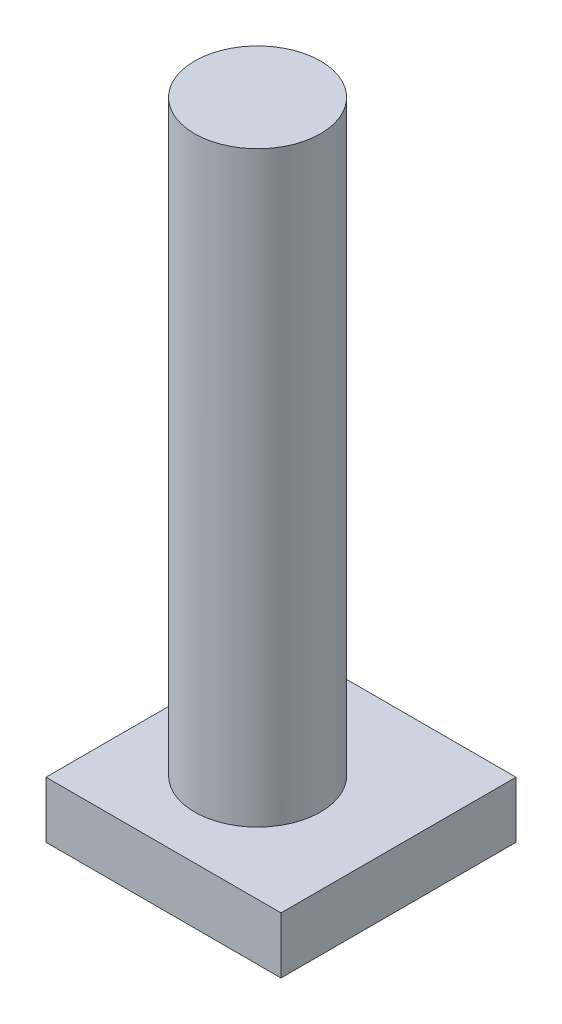
ISO-10303-21;
HEADER;
FILE_DESCRIPTION(('STEP AP214'),'2;1');
FILE_NAME('part.step','',(''),(''),'','','');
FILE_SCHEMA(('AUTOMOTIVE_DESIGN { 1 0 10303 214 1 1 1 1 }'));
ENDSEC;
DATA;
#1=APPLICATION_CONTEXT('core data for automotive mechanical design processes');
#2=APPLICATION_PROTOCOL_DEFINITION('international standard','automotive_design',2000,#1);
#3=PRODUCT_CONTEXT('',#1,'mechanical');
#4=PRODUCT('Part','Part','',(#3));
#5=PRODUCT_RELATED_PRODUCT_CATEGORY('part','',(#4));
#6=PRODUCT_DEFINITION_FORMATION('','',#4);
#7=PRODUCT_DEFINITION_CONTEXT('part definition',#1,'design');
#8=PRODUCT_DEFINITION('design','',#6,#7);
#9=PRODUCT_DEFINITION_SHAPE('','',#8);
#10=(LENGTH_UNIT() NAMED_UNIT(*) SI_UNIT(.MILLI.,.METRE.));
#11=(NAMED_UNIT(*) PLANE_ANGLE_UNIT() SI_UNIT($,.RADIAN.));
#12=(NAMED_UNIT(*) SI_UNIT($,.STERADIAN.) SOLID_ANGLE_UNIT());
#13=UNCERTAINTY_MEASURE_WITH_UNIT(LENGTH_MEASURE(1.E-05),#10,'distance_accuracy_value','');
#14=(GEOMETRIC_REPRESENTATION_CONTEXT(3) GLOBAL_UNCERTAINTY_ASSIGNED_CONTEXT((#13)) GLOBAL_UNIT_ASSIGNED_CONTEXT((#10,
#11,#12)) REPRESENTATION_CONTEXT('',''));
#15=CARTESIAN_POINT('',(0.,0.,0.));
#16=DIRECTION('',(0.,0.,1.));
#17=DIRECTION('',(1.,0.,0.));
#18=AXIS2_PLACEMENT_3D('',#15,#16,#17);
#19=CARTESIAN_POINT('',(0.,6.096,-25.4));
#20=DIRECTION('',(0.,-1.,0.));
#21=DIRECTION('',(0.,0.,-1.));
#22=AXIS2_PLACEMENT_3D('',#19,#20,#21);
#23=PLANE('',#22);
#24=DIRECTION('',(0.,0.,1.));
#25=VECTOR('',#24,1.);
#26=CARTESIAN_POINT('',(0.,6.096,0.));
#27=LINE('',#26,#25);
#28=CARTESIAN_POINT('',(0.,6.096,-25.4));
#29=VERTEX_POINT('',#28);
#30=CARTESIAN_POINT('',(0.,6.096,0.));
#31=VERTEX_POINT('',#30);
#32=EDGE_CURVE('E86',#29,#31,#27,.T.);
#33=ORIENTED_EDGE('',*,*,#32,.T.);
#34=DIRECTION('',(1.,0.,0.));
#35=VECTOR('',#34,1.);
#36=CARTESIAN_POINT('',(0.,6.096,0.));
#37=LINE('',#36,#35);
#38=CARTESIAN_POINT('',(25.4,6.096,0.));
#39=VERTEX_POINT('',#38);
#40=EDGE_CURVE('E81',#31,#39,#37,.T.);
#41=ORIENTED_EDGE('',*,*,#40,.T.);
#42=DIRECTION('',(0.,0.,-1.));
#43=VECTOR('',#42,1.);
#44=CARTESIAN_POINT('',(25.4,6.096,0.));
#45=LINE('',#44,#43);
#46=CARTESIAN_POINT('',(25.4,6.096,-25.4));
#47=VERTEX_POINT('',#46);
#48=EDGE_CURVE('E84',#39,#47,#45,.T.);
#49=ORIENTED_EDGE('',*,*,#48,.T.);
#50=DIRECTION('',(-1.,0.,0.));
#51=VECTOR('',#50,1.);
#52=CARTESIAN_POINT('',(0.,6.096,-25.4));
#53=LINE('',#52,#51);
#54=EDGE_CURVE('E50',#47,#29,#53,.T.);
#55=ORIENTED_EDGE('',*,*,#54,.T.);
#56=EDGE_LOOP('',(#33,#41,#49,#55));
#57=FACE_BOUND('',#56,.T.);
#58=CARTESIAN_POINT('',(11.2927077969403,6.096,-11.5758427740517));
#59=DIRECTION('',(0.,-1.,0.));
#60=DIRECTION('',(0.,0.,-1.));
#61=AXIS2_PLACEMENT_3D('',#58,#59,#60);
#62=CIRCLE('',#61,6.80919344335196);
#63=CARTESIAN_POINT('',(11.2927077969403,6.096,-18.3850362174037));
#64=VERTEX_POINT('',#63);
#65=EDGE_CURVE('E11',#64,#64,#62,.F.);
#66=ORIENTED_EDGE('',*,*,#65,.F.);
#67=EDGE_LOOP('',(#66));
#68=FACE_BOUND('',#67,.T.);
#69=ADVANCED_FACE('F33',(#57,#68),#23,.F.);
#70=CARTESIAN_POINT('',(0.,6.096,0.));
#71=DIRECTION('',(1.,0.,0.));
#72=DIRECTION('',(0.,0.,-1.));
#73=AXIS2_PLACEMENT_3D('',#70,#71,#72);
#74=PLANE('',#73);
#75=DIRECTION('',(0.,0.,1.));
#76=VECTOR('',#75,1.);
#77=CARTESIAN_POINT('',(0.,0.,0.));
#78=LINE('',#77,#76);
#79=CARTESIAN_POINT('',(0.,0.,-25.4));
#80=VERTEX_POINT('',#79);
#81=CARTESIAN_POINT('',(0.,0.,0.));
#82=VERTEX_POINT('',#81);
#83=EDGE_CURVE('E100',#80,#82,#78,.T.);
#84=ORIENTED_EDGE('',*,*,#83,.T.);
#85=DIRECTION('',(0.,-1.,0.));
#86=VECTOR('',#85,1.);
#87=CARTESIAN_POINT('',(0.,6.096,0.));
#88=LINE('',#87,#86);
#89=EDGE_CURVE('E42',#31,#82,#88,.T.);
#90=ORIENTED_EDGE('',*,*,#89,.F.);
#91=ORIENTED_EDGE('',*,*,#32,.F.);
#92=DIRECTION('',(0.,-1.,0.));
#93=VECTOR('',#92,1.);
#94=CARTESIAN_POINT('',(0.,6.096,-25.4));
#95=LINE('',#94,#93);
#96=EDGE_CURVE('E96',#29,#80,#95,.T.);
#97=ORIENTED_EDGE('',*,*,#96,.T.);
#98=EDGE_LOOP('',(#84,#90,#91,#97));
#99=FACE_BOUND('',#98,.T.);
#100=ADVANCED_FACE('F35',(#99),#74,.F.);
#101=CARTESIAN_POINT('',(0.,6.096,0.));
#102=DIRECTION('',(0.,0.,-1.));
#103=DIRECTION('',(-1.,0.,0.));
#104=AXIS2_PLACEMENT_3D('',#101,#102,#103);
#105=PLANE('',#104);
#106=DIRECTION('',(1.,0.,0.));
#107=VECTOR('',#106,1.);
#108=CARTESIAN_POINT('',(0.,0.,0.));
#109=LINE('',#108,#107);
#110=CARTESIAN_POINT('',(25.4,0.,0.));
#111=VERTEX_POINT('',#110);
#112=EDGE_CURVE('E91',#82,#111,#109,.T.);
#113=ORIENTED_EDGE('',*,*,#112,.T.);
#114=DIRECTION('',(0.,-1.,0.));
#115=VECTOR('',#114,1.);
#116=CARTESIAN_POINT('',(25.4,6.096,0.));
#117=LINE('',#116,#115);
#118=EDGE_CURVE('E89',#39,#111,#117,.T.);
#119=ORIENTED_EDGE('',*,*,#118,.F.);
#120=ORIENTED_EDGE('',*,*,#40,.F.);
#121=ORIENTED_EDGE('',*,*,#89,.T.);
#122=EDGE_LOOP('',(#113,#119,#120,#121));
#123=FACE_BOUND('',#122,.T.);
#124=ADVANCED_FACE('F90',(#123),#105,.F.);
#125=CARTESIAN_POINT('',(25.4,6.096,0.));
#126=DIRECTION('',(-1.,0.,0.));
#127=DIRECTION('',(0.,0.,1.));
#128=AXIS2_PLACEMENT_3D('',#125,#126,#127);
#129=PLANE('',#128);
#130=DIRECTION('',(0.,0.,-1.));
#131=VECTOR('',#130,1.);
#132=CARTESIAN_POINT('',(25.4,0.,0.));
#133=LINE('',#132,#131);
#134=CARTESIAN_POINT('',(25.4,0.,-25.4));
#135=VERTEX_POINT('',#134);
#136=EDGE_CURVE('E67',#111,#135,#133,.T.);
#137=ORIENTED_EDGE('',*,*,#136,.T.);
#138=DIRECTION('',(0.,-1.,0.));
#139=VECTOR('',#138,1.);
#140=CARTESIAN_POINT('',(25.4,6.096,-25.4));
#141=LINE('',#140,#139);
#142=EDGE_CURVE('E92',#47,#135,#141,.T.);
#143=ORIENTED_EDGE('',*,*,#142,.F.);
#144=ORIENTED_EDGE('',*,*,#48,.F.);
#145=ORIENTED_EDGE('',*,*,#118,.T.);
#146=EDGE_LOOP('',(#137,#143,#144,#145));
#147=FACE_BOUND('',#146,.T.);
#148=ADVANCED_FACE('F94',(#147),#129,.F.);
#149=CARTESIAN_POINT('',(0.,6.096,-25.4));
#150=DIRECTION('',(0.,0.,1.));
#151=DIRECTION('',(1.,0.,0.));
#152=AXIS2_PLACEMENT_3D('',#149,#150,#151);
#153=PLANE('',#152);
#154=DIRECTION('',(-1.,0.,0.));
#155=VECTOR('',#154,1.);
#156=CARTESIAN_POINT('',(0.,0.,-25.4));
#157=LINE('',#156,#155);
#158=EDGE_CURVE('E73',#135,#80,#157,.T.);
#159=ORIENTED_EDGE('',*,*,#158,.T.);
#160=ORIENTED_EDGE('',*,*,#96,.F.);
#161=ORIENTED_EDGE('',*,*,#54,.F.);
#162=ORIENTED_EDGE('',*,*,#142,.T.);
#163=EDGE_LOOP('',(#159,#160,#161,#162));
#164=FACE_BOUND('',#163,.T.);
#165=ADVANCED_FACE('F114',(#164),#153,.F.);
#166=CARTESIAN_POINT('',(0.,0.,-25.4));
#167=DIRECTION('',(0.,-1.,0.));
#168=DIRECTION('',(0.,0.,-1.));
#169=AXIS2_PLACEMENT_3D('',#166,#167,#168);
#170=PLANE('',#169);
#171=ORIENTED_EDGE('',*,*,#83,.F.);
#172=ORIENTED_EDGE('',*,*,#158,.F.);
#173=ORIENTED_EDGE('',*,*,#136,.F.);
#174=ORIENTED_EDGE('',*,*,#112,.F.);
#175=EDGE_LOOP('',(#171,#172,#173,#174));
#176=FACE_BOUND('',#175,.T.);
#177=ADVANCED_FACE('F111',(#176),#170,.T.);
#178=CARTESIAN_POINT('',(11.2927077969403,69.596,-11.5758427740517));
#179=DIRECTION('',(0.,-1.,0.));
#180=DIRECTION('',(0.,0.,-1.));
#181=AXIS2_PLACEMENT_3D('',#178,#179,#180);
#182=CYLINDRICAL_SURFACE('',#181,6.80919344335196);
#183=CARTESIAN_POINT('',(11.2927077969403,69.596,-11.5758427740517));
#184=DIRECTION('',(0.,1.,0.));
#185=DIRECTION('',(0.,0.,1.));
#186=AXIS2_PLACEMENT_3D('',#183,#184,#185);
#187=CIRCLE('',#186,6.80919344335196);
#188=CARTESIAN_POINT('',(11.2927077969403,69.596,-4.76664933069976));
#189=VERTEX_POINT('',#188);
#190=EDGE_CURVE('E103',#189,#189,#187,.T.);
#191=ORIENTED_EDGE('',*,*,#190,.F.);
#192=EDGE_LOOP('',(#191));
#193=FACE_BOUND('',#192,.T.);
#194=ORIENTED_EDGE('',*,*,#65,.T.);
#195=EDGE_LOOP('',(#194));
#196=FACE_BOUND('',#195,.T.);
#197=ADVANCED_FACE('F113',(#193,#196),#182,.T.);
#198=CARTESIAN_POINT('',(11.2927077969403,69.596,-11.5758427740517));
#199=DIRECTION('',(0.,1.,0.));
#200=DIRECTION('',(0.,0.,1.));
#201=AXIS2_PLACEMENT_3D('',#198,#199,#200);
#202=PLANE('',#201);
#203=ORIENTED_EDGE('',*,*,#190,.T.);
#204=EDGE_LOOP('',(#203));
#205=FACE_BOUND('',#204,.T.);
#206=ADVANCED_FACE('F120',(#205),#202,.T.);
#207=CLOSED_SHELL('',(#69,#100,#124,#148,#165,#177,#197,#206));
#208=MANIFOLD_SOLID_BREP('B2',#207);
#209=ADVANCED_BREP_SHAPE_REPRESENTATION('',(#18,#208),#14);
#210=SHAPE_DEFINITION_REPRESENTATION(#9,#209);
ENDSEC;
END-ISO-10303-21;
